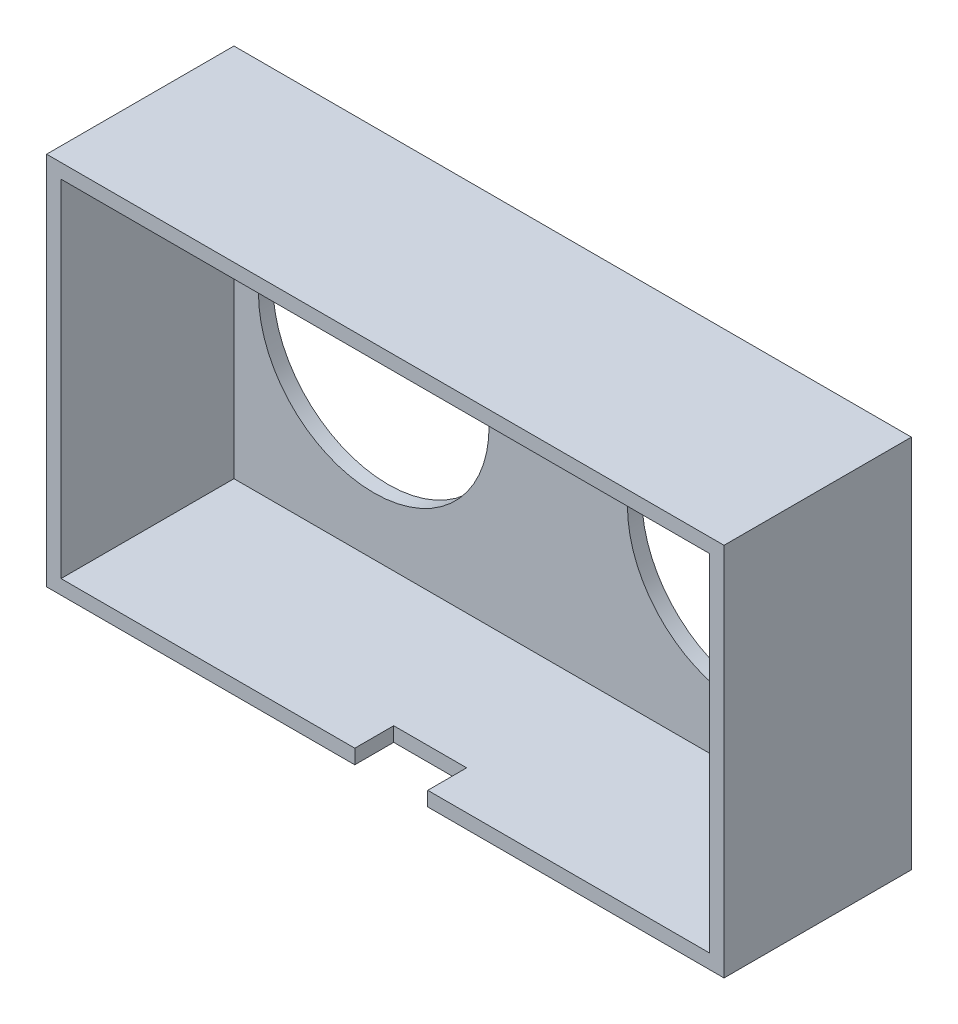
ISO-10303-21;
HEADER;
FILE_DESCRIPTION(('STEP AP214'),'2;1');
FILE_NAME('part.step','',(''),(''),'','','');
FILE_SCHEMA(('AUTOMOTIVE_DESIGN { 1 0 10303 214 1 1 1 1 }'));
ENDSEC;
DATA;
#1=APPLICATION_CONTEXT('core data for automotive mechanical design processes');
#2=APPLICATION_PROTOCOL_DEFINITION('international standard','automotive_design',2000,#1);
#3=PRODUCT_CONTEXT('',#1,'mechanical');
#4=PRODUCT('Part','Part','',(#3));
#5=PRODUCT_RELATED_PRODUCT_CATEGORY('part','',(#4));
#6=PRODUCT_DEFINITION_FORMATION('','',#4);
#7=PRODUCT_DEFINITION_CONTEXT('part definition',#1,'design');
#8=PRODUCT_DEFINITION('design','',#6,#7);
#9=PRODUCT_DEFINITION_SHAPE('','',#8);
#10=(LENGTH_UNIT() NAMED_UNIT(*) SI_UNIT(.MILLI.,.METRE.));
#11=(NAMED_UNIT(*) PLANE_ANGLE_UNIT() SI_UNIT($,.RADIAN.));
#12=(NAMED_UNIT(*) SI_UNIT($,.STERADIAN.) SOLID_ANGLE_UNIT());
#13=UNCERTAINTY_MEASURE_WITH_UNIT(LENGTH_MEASURE(1.E-05),#10,'distance_accuracy_value','');
#14=(GEOMETRIC_REPRESENTATION_CONTEXT(3) GLOBAL_UNCERTAINTY_ASSIGNED_CONTEXT((#13)) GLOBAL_UNIT_ASSIGNED_CONTEXT((#10,
#11,#12)) REPRESENTATION_CONTEXT('',''));
#15=CARTESIAN_POINT('',(0.,0.,0.));
#16=DIRECTION('',(0.,0.,1.));
#17=DIRECTION('',(1.,0.,0.));
#18=AXIS2_PLACEMENT_3D('',#15,#16,#17);
#19=CARTESIAN_POINT('',(0.,13.,1.));
#20=DIRECTION('',(0.,1.,0.));
#21=DIRECTION('',(0.,0.,1.));
#22=AXIS2_PLACEMENT_3D('',#19,#20,#21);
#23=PLANE('',#22);
#24=DIRECTION('',(1.,0.,0.));
#25=VECTOR('',#24,1.);
#26=CARTESIAN_POINT('',(0.,13.,0.));
#27=LINE('',#26,#25);
#28=CARTESIAN_POINT('',(-36.3,13.,0.));
#29=VERTEX_POINT('',#28);
#30=CARTESIAN_POINT('',(10.7,13.,0.));
#31=VERTEX_POINT('',#30);
#32=EDGE_CURVE('E175',#29,#31,#27,.T.);
#33=ORIENTED_EDGE('',*,*,#32,.F.);
#34=DIRECTION('',(0.,0.,-1.));
#35=VECTOR('',#34,1.);
#36=CARTESIAN_POINT('',(-36.3,13.,1.));
#37=LINE('',#36,#35);
#38=CARTESIAN_POINT('',(-36.3,13.,13.));
#39=VERTEX_POINT('',#38);
#40=EDGE_CURVE('E11',#39,#29,#37,.T.);
#41=ORIENTED_EDGE('',*,*,#40,.F.);
#42=DIRECTION('',(-1.,0.,0.));
#43=VECTOR('',#42,1.);
#44=CARTESIAN_POINT('',(-36.3,13.,13.));
#45=LINE('',#44,#43);
#46=CARTESIAN_POINT('',(10.7,13.,13.));
#47=VERTEX_POINT('',#46);
#48=EDGE_CURVE('E158',#47,#39,#45,.T.);
#49=ORIENTED_EDGE('',*,*,#48,.F.);
#50=DIRECTION('',(0.,0.,-1.));
#51=VECTOR('',#50,1.);
#52=CARTESIAN_POINT('',(10.7,13.,1.));
#53=LINE('',#52,#51);
#54=EDGE_CURVE('E169',#47,#31,#53,.T.);
#55=ORIENTED_EDGE('',*,*,#54,.T.);
#56=EDGE_LOOP('',(#33,#41,#49,#55));
#57=FACE_BOUND('',#56,.T.);
#58=ADVANCED_FACE('F35',(#57),#23,.T.);
#59=CARTESIAN_POINT('',(-36.3,0.,1.));
#60=DIRECTION('',(1.,0.,0.));
#61=DIRECTION('',(0.,0.,-1.));
#62=AXIS2_PLACEMENT_3D('',#59,#60,#61);
#63=PLANE('',#62);
#64=DIRECTION('',(0.,-1.,0.));
#65=VECTOR('',#64,1.);
#66=CARTESIAN_POINT('',(-36.3,0.,0.));
#67=LINE('',#66,#65);
#68=CARTESIAN_POINT('',(-36.3,-13.,0.));
#69=VERTEX_POINT('',#68);
#70=EDGE_CURVE('E178',#29,#69,#67,.T.);
#71=ORIENTED_EDGE('',*,*,#70,.T.);
#72=DIRECTION('',(0.,0.,-1.));
#73=VECTOR('',#72,1.);
#74=CARTESIAN_POINT('',(-36.3,-13.,1.));
#75=LINE('',#74,#73);
#76=CARTESIAN_POINT('',(-36.3,-13.,13.));
#77=VERTEX_POINT('',#76);
#78=EDGE_CURVE('E43',#77,#69,#75,.T.);
#79=ORIENTED_EDGE('',*,*,#78,.F.);
#80=DIRECTION('',(0.,-1.,0.));
#81=VECTOR('',#80,1.);
#82=CARTESIAN_POINT('',(-36.3,13.,13.));
#83=LINE('',#82,#81);
#84=EDGE_CURVE('E148',#39,#77,#83,.T.);
#85=ORIENTED_EDGE('',*,*,#84,.F.);
#86=ORIENTED_EDGE('',*,*,#40,.T.);
#87=EDGE_LOOP('',(#71,#79,#85,#86));
#88=FACE_BOUND('',#87,.T.);
#89=ADVANCED_FACE('F192',(#88),#63,.F.);
#90=CARTESIAN_POINT('',(0.,-13.,1.));
#91=DIRECTION('',(0.,1.,0.));
#92=DIRECTION('',(-1.,0.,0.));
#93=AXIS2_PLACEMENT_3D('',#90,#91,#92);
#94=PLANE('',#93);
#95=DIRECTION('',(1.,0.,0.));
#96=VECTOR('',#95,1.);
#97=CARTESIAN_POINT('',(-36.3,-13.,13.));
#98=LINE('',#97,#96);
#99=CARTESIAN_POINT('',(-9.85613817818321,-13.,13.));
#100=VERTEX_POINT('',#99);
#101=CARTESIAN_POINT('',(10.7,-13.,13.));
#102=VERTEX_POINT('',#101);
#103=EDGE_CURVE('E137',#100,#102,#98,.T.);
#104=ORIENTED_EDGE('',*,*,#103,.F.);
#105=DIRECTION('',(0.,0.,1.));
#106=VECTOR('',#105,1.);
#107=CARTESIAN_POINT('',(-9.85613817818321,-13.,10.3));
#108=LINE('',#107,#106);
#109=CARTESIAN_POINT('',(-9.85613817818321,-13.,10.3));
#110=VERTEX_POINT('',#109);
#111=EDGE_CURVE('E122',#110,#100,#108,.T.);
#112=ORIENTED_EDGE('',*,*,#111,.F.);
#113=DIRECTION('',(1.,0.,0.));
#114=VECTOR('',#113,1.);
#115=CARTESIAN_POINT('',(-14.917993692715,-13.,10.3));
#116=LINE('',#115,#114);
#117=CARTESIAN_POINT('',(-14.917993692715,-13.,10.3));
#118=VERTEX_POINT('',#117);
#119=EDGE_CURVE('E131',#118,#110,#116,.T.);
#120=ORIENTED_EDGE('',*,*,#119,.F.);
#121=DIRECTION('',(0.,0.,1.));
#122=VECTOR('',#121,1.);
#123=CARTESIAN_POINT('',(-14.917993692715,-13.,10.3));
#124=LINE('',#123,#122);
#125=CARTESIAN_POINT('',(-14.917993692715,-13.,13.));
#126=VERTEX_POINT('',#125);
#127=EDGE_CURVE('E130',#118,#126,#124,.T.);
#128=ORIENTED_EDGE('',*,*,#127,.T.);
#129=EDGE_CURVE('E147',#77,#126,#98,.T.);
#130=ORIENTED_EDGE('',*,*,#129,.F.);
#131=ORIENTED_EDGE('',*,*,#78,.T.);
#132=DIRECTION('',(1.,0.,0.));
#133=VECTOR('',#132,1.);
#134=CARTESIAN_POINT('',(0.,-13.,0.));
#135=LINE('',#134,#133);
#136=CARTESIAN_POINT('',(10.7,-13.,0.));
#137=VERTEX_POINT('',#136);
#138=EDGE_CURVE('E181',#69,#137,#135,.T.);
#139=ORIENTED_EDGE('',*,*,#138,.T.);
#140=DIRECTION('',(0.,0.,-1.));
#141=VECTOR('',#140,1.);
#142=CARTESIAN_POINT('',(10.7,-13.,1.));
#143=LINE('',#142,#141);
#144=EDGE_CURVE('E145',#102,#137,#143,.T.);
#145=ORIENTED_EDGE('',*,*,#144,.F.);
#146=EDGE_LOOP('',(#104,#112,#120,#128,#130,#131,#139,#145));
#147=FACE_BOUND('',#146,.T.);
#148=ADVANCED_FACE('F143',(#147),#94,.F.);
#149=CARTESIAN_POINT('',(0.,0.,1.));
#150=DIRECTION('',(0.,0.,-1.));
#151=DIRECTION('',(-1.,0.,0.));
#152=AXIS2_PLACEMENT_3D('',#149,#150,#151);
#153=CYLINDRICAL_SURFACE('',#152,8.);
#154=CARTESIAN_POINT('',(0.,0.,1.));
#155=DIRECTION('',(0.,0.,1.));
#156=DIRECTION('',(1.,0.,0.));
#157=AXIS2_PLACEMENT_3D('',#154,#155,#156);
#158=CIRCLE('',#157,8.);
#159=CARTESIAN_POINT('',(8.,0.,1.));
#160=VERTEX_POINT('',#159);
#161=EDGE_CURVE('E165',#160,#160,#158,.T.);
#162=ORIENTED_EDGE('',*,*,#161,.T.);
#163=EDGE_LOOP('',(#162));
#164=FACE_BOUND('',#163,.T.);
#165=CARTESIAN_POINT('',(0.,0.,0.));
#166=DIRECTION('',(0.,0.,1.));
#167=DIRECTION('',(1.,0.,0.));
#168=AXIS2_PLACEMENT_3D('',#165,#166,#167);
#169=CIRCLE('',#168,8.);
#170=CARTESIAN_POINT('',(8.,0.,0.));
#171=VERTEX_POINT('',#170);
#172=EDGE_CURVE('E172',#171,#171,#169,.T.);
#173=ORIENTED_EDGE('',*,*,#172,.F.);
#174=EDGE_LOOP('',(#173));
#175=FACE_BOUND('',#174,.T.);
#176=ADVANCED_FACE('F277',(#164,#175),#153,.F.);
#177=CARTESIAN_POINT('',(-25.6,0.,1.));
#178=DIRECTION('',(0.,0.,-1.));
#179=DIRECTION('',(-1.,0.,0.));
#180=AXIS2_PLACEMENT_3D('',#177,#178,#179);
#181=CYLINDRICAL_SURFACE('',#180,8.);
#182=CARTESIAN_POINT('',(-25.6,0.,1.));
#183=DIRECTION('',(0.,0.,1.));
#184=DIRECTION('',(1.,0.,0.));
#185=AXIS2_PLACEMENT_3D('',#182,#183,#184);
#186=CIRCLE('',#185,8.);
#187=CARTESIAN_POINT('',(-17.6,0.,1.));
#188=VERTEX_POINT('',#187);
#189=EDGE_CURVE('E162',#188,#188,#186,.T.);
#190=ORIENTED_EDGE('',*,*,#189,.T.);
#191=EDGE_LOOP('',(#190));
#192=FACE_BOUND('',#191,.T.);
#193=CARTESIAN_POINT('',(-25.6,0.,0.));
#194=DIRECTION('',(0.,0.,1.));
#195=DIRECTION('',(1.,0.,0.));
#196=AXIS2_PLACEMENT_3D('',#193,#194,#195);
#197=CIRCLE('',#196,8.);
#198=CARTESIAN_POINT('',(-17.6,0.,0.));
#199=VERTEX_POINT('',#198);
#200=EDGE_CURVE('E161',#199,#199,#197,.T.);
#201=ORIENTED_EDGE('',*,*,#200,.F.);
#202=EDGE_LOOP('',(#201));
#203=FACE_BOUND('',#202,.T.);
#204=ADVANCED_FACE('F37',(#192,#203),#181,.F.);
#205=CARTESIAN_POINT('',(10.7,0.,1.));
#206=DIRECTION('',(1.,0.,0.));
#207=DIRECTION('',(0.,1.,0.));
#208=AXIS2_PLACEMENT_3D('',#205,#206,#207);
#209=PLANE('',#208);
#210=DIRECTION('',(0.,-1.,0.));
#211=VECTOR('',#210,1.);
#212=CARTESIAN_POINT('',(10.7,0.,0.));
#213=LINE('',#212,#211);
#214=EDGE_CURVE('E166',#31,#137,#213,.T.);
#215=ORIENTED_EDGE('',*,*,#214,.F.);
#216=ORIENTED_EDGE('',*,*,#54,.F.);
#217=DIRECTION('',(0.,1.,0.));
#218=VECTOR('',#217,1.);
#219=CARTESIAN_POINT('',(10.7,13.,13.));
#220=LINE('',#219,#218);
#221=EDGE_CURVE('E151',#102,#47,#220,.T.);
#222=ORIENTED_EDGE('',*,*,#221,.F.);
#223=ORIENTED_EDGE('',*,*,#144,.T.);
#224=EDGE_LOOP('',(#215,#216,#222,#223));
#225=FACE_BOUND('',#224,.T.);
#226=ADVANCED_FACE('F200',(#225),#209,.T.);
#227=CARTESIAN_POINT('',(0.,0.,1.));
#228=DIRECTION('',(0.,0.,1.));
#229=DIRECTION('',(1.,0.,0.));
#230=AXIS2_PLACEMENT_3D('',#227,#228,#229);
#231=PLANE('',#230);
#232=DIRECTION('',(-1.,0.,0.));
#233=VECTOR('',#232,1.);
#234=CARTESIAN_POINT('',(-35.3,12.,1.));
#235=LINE('',#234,#233);
#236=CARTESIAN_POINT('',(9.7,12.,1.));
#237=VERTEX_POINT('',#236);
#238=CARTESIAN_POINT('',(-35.3,12.,1.));
#239=VERTEX_POINT('',#238);
#240=EDGE_CURVE('E58',#237,#239,#235,.T.);
#241=ORIENTED_EDGE('',*,*,#240,.T.);
#242=DIRECTION('',(0.,-1.,0.));
#243=VECTOR('',#242,1.);
#244=CARTESIAN_POINT('',(-35.3,12.,1.));
#245=LINE('',#244,#243);
#246=CARTESIAN_POINT('',(-35.3,-12.,1.));
#247=VERTEX_POINT('',#246);
#248=EDGE_CURVE('E228',#239,#247,#245,.T.);
#249=ORIENTED_EDGE('',*,*,#248,.T.);
#250=DIRECTION('',(1.,0.,0.));
#251=VECTOR('',#250,1.);
#252=CARTESIAN_POINT('',(-35.3,-12.,1.));
#253=LINE('',#252,#251);
#254=CARTESIAN_POINT('',(9.7,-12.,1.));
#255=VERTEX_POINT('',#254);
#256=EDGE_CURVE('E231',#247,#255,#253,.T.);
#257=ORIENTED_EDGE('',*,*,#256,.T.);
#258=DIRECTION('',(0.,1.,0.));
#259=VECTOR('',#258,1.);
#260=CARTESIAN_POINT('',(9.7,12.,1.));
#261=LINE('',#260,#259);
#262=EDGE_CURVE('E233',#255,#237,#261,.T.);
#263=ORIENTED_EDGE('',*,*,#262,.T.);
#264=EDGE_LOOP('',(#241,#249,#257,#263));
#265=FACE_BOUND('',#264,.T.);
#266=ORIENTED_EDGE('',*,*,#189,.F.);
#267=EDGE_LOOP('',(#266));
#268=FACE_BOUND('',#267,.T.);
#269=ORIENTED_EDGE('',*,*,#161,.F.);
#270=EDGE_LOOP('',(#269));
#271=FACE_BOUND('',#270,.T.);
#272=ADVANCED_FACE('F289',(#265,#268,#271),#231,.T.);
#273=CARTESIAN_POINT('',(0.,0.,0.));
#274=DIRECTION('',(0.,0.,1.));
#275=DIRECTION('',(1.,0.,0.));
#276=AXIS2_PLACEMENT_3D('',#273,#274,#275);
#277=PLANE('',#276);
#278=ORIENTED_EDGE('',*,*,#200,.T.);
#279=EDGE_LOOP('',(#278));
#280=FACE_BOUND('',#279,.T.);
#281=ORIENTED_EDGE('',*,*,#172,.T.);
#282=EDGE_LOOP('',(#281));
#283=FACE_BOUND('',#282,.T.);
#284=ORIENTED_EDGE('',*,*,#32,.T.);
#285=ORIENTED_EDGE('',*,*,#214,.T.);
#286=ORIENTED_EDGE('',*,*,#138,.F.);
#287=ORIENTED_EDGE('',*,*,#70,.F.);
#288=EDGE_LOOP('',(#284,#285,#286,#287));
#289=FACE_BOUND('',#288,.T.);
#290=ADVANCED_FACE('F195',(#280,#283,#289),#277,.F.);
#291=CARTESIAN_POINT('',(0.,0.,13.));
#292=DIRECTION('',(0.,0.,1.));
#293=DIRECTION('',(1.,0.,0.));
#294=AXIS2_PLACEMENT_3D('',#291,#292,#293);
#295=PLANE('',#294);
#296=DIRECTION('',(0.,-1.,0.));
#297=VECTOR('',#296,1.);
#298=CARTESIAN_POINT('',(-9.85613817818321,13.001,13.));
#299=LINE('',#298,#297);
#300=CARTESIAN_POINT('',(-9.85613817818322,-12.,13.));
#301=VERTEX_POINT('',#300);
#302=EDGE_CURVE('E125',#301,#100,#299,.T.);
#303=ORIENTED_EDGE('',*,*,#302,.T.);
#304=ORIENTED_EDGE('',*,*,#103,.T.);
#305=ORIENTED_EDGE('',*,*,#221,.T.);
#306=ORIENTED_EDGE('',*,*,#48,.T.);
#307=ORIENTED_EDGE('',*,*,#84,.T.);
#308=ORIENTED_EDGE('',*,*,#129,.T.);
#309=DIRECTION('',(0.,-1.,0.));
#310=VECTOR('',#309,1.);
#311=CARTESIAN_POINT('',(-14.917993692715,13.001,13.));
#312=LINE('',#311,#310);
#313=CARTESIAN_POINT('',(-14.917993692715,-12.,13.));
#314=VERTEX_POINT('',#313);
#315=EDGE_CURVE('E141',#314,#126,#312,.T.);
#316=ORIENTED_EDGE('',*,*,#315,.F.);
#317=DIRECTION('',(1.,0.,0.));
#318=VECTOR('',#317,1.);
#319=CARTESIAN_POINT('',(-35.3,-12.,13.));
#320=LINE('',#319,#318);
#321=CARTESIAN_POINT('',(-35.3,-12.,13.));
#322=VERTEX_POINT('',#321);
#323=EDGE_CURVE('E205',#322,#314,#320,.T.);
#324=ORIENTED_EDGE('',*,*,#323,.F.);
#325=DIRECTION('',(0.,-1.,0.));
#326=VECTOR('',#325,1.);
#327=CARTESIAN_POINT('',(-35.3,12.,13.));
#328=LINE('',#327,#326);
#329=CARTESIAN_POINT('',(-35.3,12.,13.));
#330=VERTEX_POINT('',#329);
#331=EDGE_CURVE('E223',#330,#322,#328,.T.);
#332=ORIENTED_EDGE('',*,*,#331,.F.);
#333=DIRECTION('',(-1.,0.,0.));
#334=VECTOR('',#333,1.);
#335=CARTESIAN_POINT('',(-35.3,12.,13.));
#336=LINE('',#335,#334);
#337=CARTESIAN_POINT('',(9.7,12.,13.));
#338=VERTEX_POINT('',#337);
#339=EDGE_CURVE('E235',#338,#330,#336,.T.);
#340=ORIENTED_EDGE('',*,*,#339,.F.);
#341=DIRECTION('',(0.,1.,0.));
#342=VECTOR('',#341,1.);
#343=CARTESIAN_POINT('',(9.7,12.,13.));
#344=LINE('',#343,#342);
#345=CARTESIAN_POINT('',(9.7,-12.,13.));
#346=VERTEX_POINT('',#345);
#347=EDGE_CURVE('E219',#346,#338,#344,.T.);
#348=ORIENTED_EDGE('',*,*,#347,.F.);
#349=EDGE_CURVE('E140',#301,#346,#320,.T.);
#350=ORIENTED_EDGE('',*,*,#349,.F.);
#351=EDGE_LOOP('',(#303,#304,#305,#306,#307,#308,#316,#324,#332,#340,#348,#350));
#352=FACE_BOUND('',#351,.T.);
#353=ADVANCED_FACE('F135',(#352),#295,.T.);
#354=CARTESIAN_POINT('',(-35.3,12.,13.));
#355=DIRECTION('',(0.,-1.,0.));
#356=DIRECTION('',(0.,0.,-1.));
#357=AXIS2_PLACEMENT_3D('',#354,#355,#356);
#358=PLANE('',#357);
#359=ORIENTED_EDGE('',*,*,#240,.F.);
#360=DIRECTION('',(0.,0.,-1.));
#361=VECTOR('',#360,1.);
#362=CARTESIAN_POINT('',(9.7,12.,13.));
#363=LINE('',#362,#361);
#364=EDGE_CURVE('E221',#338,#237,#363,.T.);
#365=ORIENTED_EDGE('',*,*,#364,.F.);
#366=ORIENTED_EDGE('',*,*,#339,.T.);
#367=DIRECTION('',(0.,0.,-1.));
#368=VECTOR('',#367,1.);
#369=CARTESIAN_POINT('',(-35.3,12.,13.));
#370=LINE('',#369,#368);
#371=EDGE_CURVE('E153',#330,#239,#370,.T.);
#372=ORIENTED_EDGE('',*,*,#371,.T.);
#373=EDGE_LOOP('',(#359,#365,#366,#372));
#374=FACE_BOUND('',#373,.T.);
#375=ADVANCED_FACE('F244',(#374),#358,.T.);
#376=CARTESIAN_POINT('',(-35.3,12.,13.));
#377=DIRECTION('',(1.,0.,0.));
#378=DIRECTION('',(0.,0.,-1.));
#379=AXIS2_PLACEMENT_3D('',#376,#377,#378);
#380=PLANE('',#379);
#381=ORIENTED_EDGE('',*,*,#248,.F.);
#382=ORIENTED_EDGE('',*,*,#371,.F.);
#383=ORIENTED_EDGE('',*,*,#331,.T.);
#384=DIRECTION('',(0.,0.,-1.));
#385=VECTOR('',#384,1.);
#386=CARTESIAN_POINT('',(-35.3,-12.,13.));
#387=LINE('',#386,#385);
#388=EDGE_CURVE('E218',#322,#247,#387,.T.);
#389=ORIENTED_EDGE('',*,*,#388,.T.);
#390=EDGE_LOOP('',(#381,#382,#383,#389));
#391=FACE_BOUND('',#390,.T.);
#392=ADVANCED_FACE('F248',(#391),#380,.T.);
#393=CARTESIAN_POINT('',(-35.3,-12.,13.));
#394=DIRECTION('',(0.,1.,0.));
#395=DIRECTION('',(0.,0.,1.));
#396=AXIS2_PLACEMENT_3D('',#393,#394,#395);
#397=PLANE('',#396);
#398=DIRECTION('',(0.,0.,1.));
#399=VECTOR('',#398,1.);
#400=CARTESIAN_POINT('',(-9.85613817818321,-12.,10.3));
#401=LINE('',#400,#399);
#402=CARTESIAN_POINT('',(-9.85613817818321,-12.,10.3));
#403=VERTEX_POINT('',#402);
#404=EDGE_CURVE('E229',#403,#301,#401,.T.);
#405=ORIENTED_EDGE('',*,*,#404,.T.);
#406=ORIENTED_EDGE('',*,*,#349,.T.);
#407=DIRECTION('',(0.,0.,-1.));
#408=VECTOR('',#407,1.);
#409=CARTESIAN_POINT('',(9.7,-12.,13.));
#410=LINE('',#409,#408);
#411=EDGE_CURVE('E238',#346,#255,#410,.T.);
#412=ORIENTED_EDGE('',*,*,#411,.T.);
#413=ORIENTED_EDGE('',*,*,#256,.F.);
#414=ORIENTED_EDGE('',*,*,#388,.F.);
#415=ORIENTED_EDGE('',*,*,#323,.T.);
#416=DIRECTION('',(0.,0.,1.));
#417=VECTOR('',#416,1.);
#418=CARTESIAN_POINT('',(-14.917993692715,-12.,10.3));
#419=LINE('',#418,#417);
#420=CARTESIAN_POINT('',(-14.917993692715,-12.,10.3));
#421=VERTEX_POINT('',#420);
#422=EDGE_CURVE('E215',#421,#314,#419,.T.);
#423=ORIENTED_EDGE('',*,*,#422,.F.);
#424=DIRECTION('',(1.,0.,0.));
#425=VECTOR('',#424,1.);
#426=CARTESIAN_POINT('',(-14.917993692715,-12.,10.3));
#427=LINE('',#426,#425);
#428=EDGE_CURVE('E208',#421,#403,#427,.T.);
#429=ORIENTED_EDGE('',*,*,#428,.T.);
#430=EDGE_LOOP('',(#405,#406,#412,#413,#414,#415,#423,#429));
#431=FACE_BOUND('',#430,.T.);
#432=ADVANCED_FACE('F213',(#431),#397,.T.);
#433=CARTESIAN_POINT('',(9.7,12.,13.));
#434=DIRECTION('',(-1.,0.,0.));
#435=DIRECTION('',(0.,0.,1.));
#436=AXIS2_PLACEMENT_3D('',#433,#434,#435);
#437=PLANE('',#436);
#438=ORIENTED_EDGE('',*,*,#262,.F.);
#439=ORIENTED_EDGE('',*,*,#411,.F.);
#440=ORIENTED_EDGE('',*,*,#347,.T.);
#441=ORIENTED_EDGE('',*,*,#364,.T.);
#442=EDGE_LOOP('',(#438,#439,#440,#441));
#443=FACE_BOUND('',#442,.T.);
#444=ADVANCED_FACE('F267',(#443),#437,.T.);
#445=CARTESIAN_POINT('',(-9.85613817818321,13.001,10.3));
#446=DIRECTION('',(1.,0.,0.));
#447=DIRECTION('',(0.,1.,0.));
#448=AXIS2_PLACEMENT_3D('',#445,#446,#447);
#449=PLANE('',#448);
#450=ORIENTED_EDGE('',*,*,#404,.F.);
#451=DIRECTION('',(0.,-1.,0.));
#452=VECTOR('',#451,1.);
#453=CARTESIAN_POINT('',(-9.85613817818321,13.001,10.3));
#454=LINE('',#453,#452);
#455=EDGE_CURVE('E50',#403,#110,#454,.T.);
#456=ORIENTED_EDGE('',*,*,#455,.T.);
#457=ORIENTED_EDGE('',*,*,#111,.T.);
#458=ORIENTED_EDGE('',*,*,#302,.F.);
#459=EDGE_LOOP('',(#450,#456,#457,#458));
#460=FACE_BOUND('',#459,.T.);
#461=ADVANCED_FACE('F124',(#460),#449,.F.);
#462=CARTESIAN_POINT('',(-14.917993692715,13.001,10.3));
#463=DIRECTION('',(1.,0.,0.));
#464=DIRECTION('',(0.,1.,0.));
#465=AXIS2_PLACEMENT_3D('',#462,#463,#464);
#466=PLANE('',#465);
#467=ORIENTED_EDGE('',*,*,#315,.T.);
#468=ORIENTED_EDGE('',*,*,#127,.F.);
#469=DIRECTION('',(0.,-1.,0.));
#470=VECTOR('',#469,1.);
#471=CARTESIAN_POINT('',(-14.917993692715,13.001,10.3));
#472=LINE('',#471,#470);
#473=EDGE_CURVE('E251',#421,#118,#472,.T.);
#474=ORIENTED_EDGE('',*,*,#473,.F.);
#475=ORIENTED_EDGE('',*,*,#422,.T.);
#476=EDGE_LOOP('',(#467,#468,#474,#475));
#477=FACE_BOUND('',#476,.T.);
#478=ADVANCED_FACE('F259',(#477),#466,.T.);
#479=CARTESIAN_POINT('',(-14.917993692715,13.001,10.3));
#480=DIRECTION('',(0.,0.,-1.));
#481=DIRECTION('',(-1.,0.,0.));
#482=AXIS2_PLACEMENT_3D('',#479,#480,#481);
#483=PLANE('',#482);
#484=ORIENTED_EDGE('',*,*,#473,.T.);
#485=ORIENTED_EDGE('',*,*,#119,.T.);
#486=ORIENTED_EDGE('',*,*,#455,.F.);
#487=ORIENTED_EDGE('',*,*,#428,.F.);
#488=EDGE_LOOP('',(#484,#485,#486,#487));
#489=FACE_BOUND('',#488,.T.);
#490=ADVANCED_FACE('F258',(#489),#483,.F.);
#491=CLOSED_SHELL('',(#58,#89,#148,#176,#204,#226,#272,#290,#353,#375,#392,#432,#444,#461,#478,#490));
#492=MANIFOLD_SOLID_BREP('B2',#491);
#493=ADVANCED_BREP_SHAPE_REPRESENTATION('',(#18,#492),#14);
#494=SHAPE_DEFINITION_REPRESENTATION(#9,#493);
ENDSEC;
END-ISO-10303-21;
